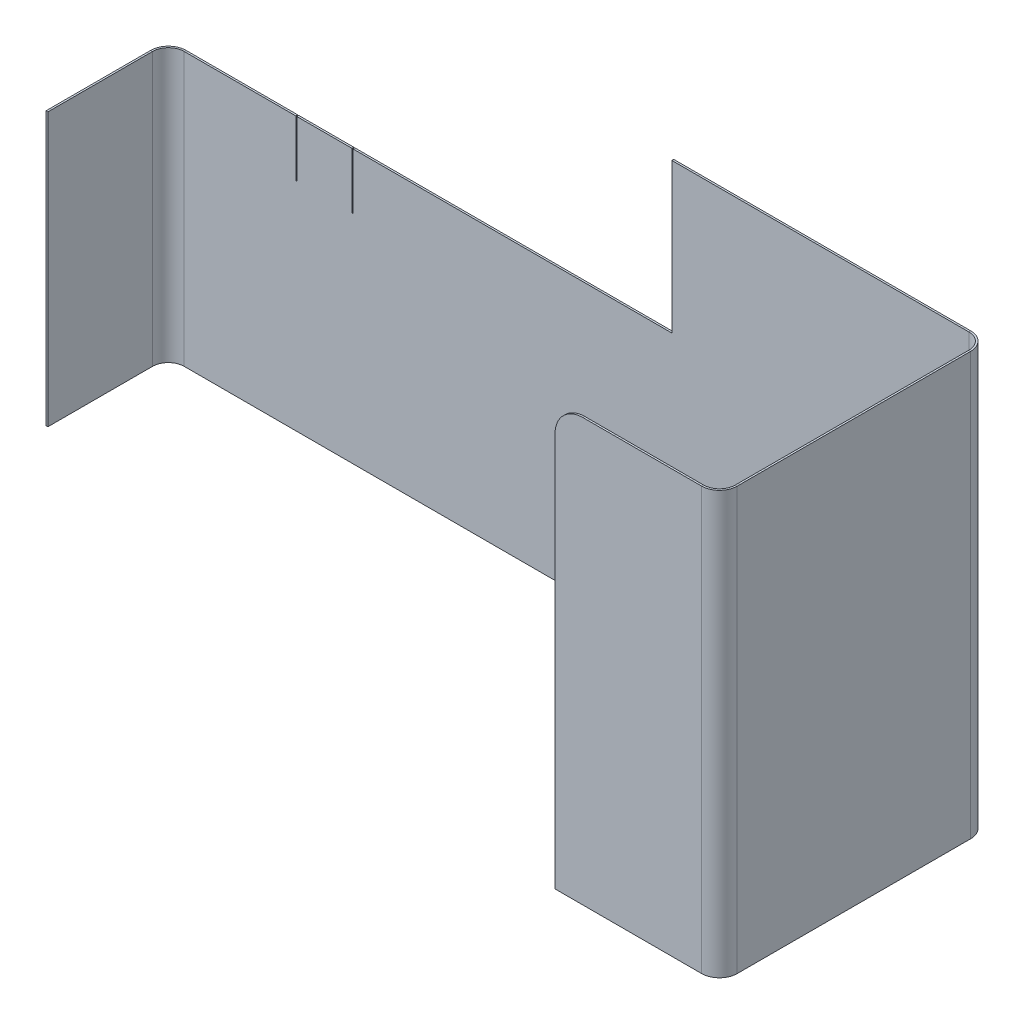
ISO-10303-21;
HEADER;
FILE_DESCRIPTION(('STEP AP214'),'2;1');
FILE_NAME('part.step','',(''),(''),'','','');
FILE_SCHEMA(('AUTOMOTIVE_DESIGN { 1 0 10303 214 1 1 1 1 }'));
ENDSEC;
DATA;
#1=APPLICATION_CONTEXT('core data for automotive mechanical design processes');
#2=APPLICATION_PROTOCOL_DEFINITION('international standard','automotive_design',2000,#1);
#3=PRODUCT_CONTEXT('',#1,'mechanical');
#4=PRODUCT('Part','Part','',(#3));
#5=PRODUCT_RELATED_PRODUCT_CATEGORY('part','',(#4));
#6=PRODUCT_DEFINITION_FORMATION('','',#4);
#7=PRODUCT_DEFINITION_CONTEXT('part definition',#1,'design');
#8=PRODUCT_DEFINITION('design','',#6,#7);
#9=PRODUCT_DEFINITION_SHAPE('','',#8);
#10=(LENGTH_UNIT() NAMED_UNIT(*) SI_UNIT(.MILLI.,.METRE.));
#11=(NAMED_UNIT(*) PLANE_ANGLE_UNIT() SI_UNIT($,.RADIAN.));
#12=(NAMED_UNIT(*) SI_UNIT($,.STERADIAN.) SOLID_ANGLE_UNIT());
#13=UNCERTAINTY_MEASURE_WITH_UNIT(LENGTH_MEASURE(1.E-05),#10,'distance_accuracy_value','');
#14=(GEOMETRIC_REPRESENTATION_CONTEXT(3) GLOBAL_UNCERTAINTY_ASSIGNED_CONTEXT((#13)) GLOBAL_UNIT_ASSIGNED_CONTEXT((#10,
#11,#12)) REPRESENTATION_CONTEXT('',''));
#15=CARTESIAN_POINT('',(0.,0.,0.));
#16=DIRECTION('',(0.,0.,1.));
#17=DIRECTION('',(1.,0.,0.));
#18=AXIS2_PLACEMENT_3D('',#15,#16,#17);
#19=CARTESIAN_POINT('',(0.,146.,0.));
#20=DIRECTION('',(0.,-1.,0.));
#21=DIRECTION('',(0.,0.,-1.));
#22=AXIS2_PLACEMENT_3D('',#19,#20,#21);
#23=PLANE('',#22);
#24=DIRECTION('',(-1.,0.,0.));
#25=VECTOR('',#24,1.);
#26=CARTESIAN_POINT('',(51.,146.,-94.5));
#27=LINE('',#26,#25);
#28=CARTESIAN_POINT('',(51.,146.,-94.5));
#29=VERTEX_POINT('',#28);
#30=CARTESIAN_POINT('',(-119.75,146.,-94.5));
#31=VERTEX_POINT('',#30);
#32=EDGE_CURVE('E276',#29,#31,#27,.T.);
#33=ORIENTED_EDGE('',*,*,#32,.T.);
#34=DIRECTION('',(0.,0.,-1.));
#35=VECTOR('',#34,1.);
#36=CARTESIAN_POINT('',(-119.75,146.,-84.5));
#37=LINE('',#36,#35);
#38=CARTESIAN_POINT('',(-119.75,146.,-93.5));
#39=VERTEX_POINT('',#38);
#40=EDGE_CURVE('E243',#39,#31,#37,.T.);
#41=ORIENTED_EDGE('',*,*,#40,.F.);
#42=DIRECTION('',(1.,0.,0.));
#43=VECTOR('',#42,1.);
#44=CARTESIAN_POINT('',(219.5,146.,-93.5));
#45=LINE('',#44,#43);
#46=CARTESIAN_POINT('',(51.,146.,-93.5));
#47=VERTEX_POINT('',#46);
#48=EDGE_CURVE('E287',#39,#47,#45,.T.);
#49=ORIENTED_EDGE('',*,*,#48,.T.);
#50=DIRECTION('',(0.,0.,-1.));
#51=VECTOR('',#50,1.);
#52=CARTESIAN_POINT('',(51.,146.,-94.5));
#53=LINE('',#52,#51);
#54=EDGE_CURVE('E273',#47,#29,#53,.T.);
#55=ORIENTED_EDGE('',*,*,#54,.T.);
#56=EDGE_LOOP('',(#33,#41,#49,#55));
#57=FACE_BOUND('',#56,.T.);
#58=ADVANCED_FACE('F38',(#57),#23,.F.);
#59=CARTESIAN_POINT('',(-210.,146.,-93.5));
#60=VERTEX_POINT('',#59);
#61=CARTESIAN_POINT('',(-150.25,146.,-93.5));
#62=VERTEX_POINT('',#61);
#63=EDGE_CURVE('E288',#60,#62,#45,.T.);
#64=ORIENTED_EDGE('',*,*,#63,.T.);
#65=DIRECTION('',(0.,0.,-1.));
#66=VECTOR('',#65,1.);
#67=CARTESIAN_POINT('',(-150.25,146.,-84.5));
#68=LINE('',#67,#66);
#69=CARTESIAN_POINT('',(-150.25,146.,-94.5));
#70=VERTEX_POINT('',#69);
#71=EDGE_CURVE('E254',#62,#70,#68,.T.);
#72=ORIENTED_EDGE('',*,*,#71,.T.);
#73=CARTESIAN_POINT('',(-210.,146.,-94.5));
#74=VERTEX_POINT('',#73);
#75=EDGE_CURVE('E275',#70,#74,#27,.T.);
#76=ORIENTED_EDGE('',*,*,#75,.T.);
#77=DIRECTION('',(0.,0.,1.));
#78=VECTOR('',#77,1.);
#79=CARTESIAN_POINT('',(-210.,146.,-94.5));
#80=LINE('',#79,#78);
#81=EDGE_CURVE('E11',#74,#60,#80,.T.);
#82=ORIENTED_EDGE('',*,*,#81,.T.);
#83=EDGE_LOOP('',(#64,#72,#76,#82));
#84=FACE_BOUND('',#83,.T.);
#85=ADVANCED_FACE('F494',(#84),#23,.F.);
#86=CARTESIAN_POINT('',(-149.75,146.,-93.5));
#87=VERTEX_POINT('',#86);
#88=CARTESIAN_POINT('',(-120.25,146.,-93.5));
#89=VERTEX_POINT('',#88);
#90=EDGE_CURVE('E292',#87,#89,#45,.T.);
#91=ORIENTED_EDGE('',*,*,#90,.T.);
#92=DIRECTION('',(0.,0.,-1.));
#93=VECTOR('',#92,1.);
#94=CARTESIAN_POINT('',(-120.25,146.,-84.5));
#95=LINE('',#94,#93);
#96=CARTESIAN_POINT('',(-120.25,146.,-94.5));
#97=VERTEX_POINT('',#96);
#98=EDGE_CURVE('E227',#89,#97,#95,.T.);
#99=ORIENTED_EDGE('',*,*,#98,.T.);
#100=CARTESIAN_POINT('',(-149.75,146.,-94.5));
#101=VERTEX_POINT('',#100);
#102=EDGE_CURVE('E238',#97,#101,#27,.T.);
#103=ORIENTED_EDGE('',*,*,#102,.T.);
#104=DIRECTION('',(0.,0.,-1.));
#105=VECTOR('',#104,1.);
#106=CARTESIAN_POINT('',(-149.75,146.,-84.5));
#107=LINE('',#106,#105);
#108=EDGE_CURVE('E61',#87,#101,#107,.T.);
#109=ORIENTED_EDGE('',*,*,#108,.F.);
#110=EDGE_LOOP('',(#91,#99,#103,#109));
#111=FACE_BOUND('',#110,.T.);
#112=ADVANCED_FACE('F499',(#111),#23,.F.);
#113=DIRECTION('',(0.,0.,-1.));
#114=VECTOR('',#113,1.);
#115=CARTESIAN_POINT('',(-218.5,146.,-94.5));
#116=LINE('',#115,#114);
#117=CARTESIAN_POINT('',(-218.5,146.,-29.));
#118=VERTEX_POINT('',#117);
#119=CARTESIAN_POINT('',(-218.5,146.,-85.));
#120=VERTEX_POINT('',#119);
#121=EDGE_CURVE('E295',#118,#120,#116,.T.);
#122=ORIENTED_EDGE('',*,*,#121,.T.);
#123=DIRECTION('',(-1.,0.,0.));
#124=VECTOR('',#123,1.);
#125=CARTESIAN_POINT('',(-218.5,146.,-85.));
#126=LINE('',#125,#124);
#127=CARTESIAN_POINT('',(-219.5,146.,-85.));
#128=VERTEX_POINT('',#127);
#129=EDGE_CURVE('E46',#120,#128,#126,.T.);
#130=ORIENTED_EDGE('',*,*,#129,.T.);
#131=DIRECTION('',(0.,0.,1.));
#132=VECTOR('',#131,1.);
#133=CARTESIAN_POINT('',(-219.5,146.,-94.5));
#134=LINE('',#133,#132);
#135=CARTESIAN_POINT('',(-219.5,146.,-29.));
#136=VERTEX_POINT('',#135);
#137=EDGE_CURVE('E279',#128,#136,#134,.T.);
#138=ORIENTED_EDGE('',*,*,#137,.T.);
#139=DIRECTION('',(1.,0.,0.));
#140=VECTOR('',#139,1.);
#141=CARTESIAN_POINT('',(51.,146.,-29.));
#142=LINE('',#141,#140);
#143=EDGE_CURVE('E281',#136,#118,#142,.T.);
#144=ORIENTED_EDGE('',*,*,#143,.T.);
#145=EDGE_LOOP('',(#122,#130,#138,#144));
#146=FACE_BOUND('',#145,.T.);
#147=ADVANCED_FACE('F452',(#146),#23,.F.);
#148=CARTESIAN_POINT('',(210.,226.,49.5));
#149=DIRECTION('',(0.,1.,0.));
#150=DIRECTION('',(0.,0.,1.));
#151=AXIS2_PLACEMENT_3D('',#148,#149,#150);
#152=PLANE('',#151);
#153=DIRECTION('',(0.,0.,-1.));
#154=VECTOR('',#153,1.);
#155=CARTESIAN_POINT('',(210.,226.,49.5));
#156=LINE('',#155,#154);
#157=CARTESIAN_POINT('',(210.,226.,49.5));
#158=VERTEX_POINT('',#157);
#159=CARTESIAN_POINT('',(210.,226.,48.5));
#160=VERTEX_POINT('',#159);
#161=EDGE_CURVE('E436',#158,#160,#156,.T.);
#162=ORIENTED_EDGE('',*,*,#161,.F.);
#163=CARTESIAN_POINT('',(210.,226.,40.));
#164=DIRECTION('',(0.,-1.,0.));
#165=DIRECTION('',(0.,0.,-1.));
#166=AXIS2_PLACEMENT_3D('',#163,#164,#165);
#167=CIRCLE('',#166,9.5);
#168=CARTESIAN_POINT('',(219.5,226.,40.));
#169=VERTEX_POINT('',#168);
#170=EDGE_CURVE('E318',#158,#169,#167,.F.);
#171=ORIENTED_EDGE('',*,*,#170,.T.);
#172=DIRECTION('',(1.,0.,0.));
#173=VECTOR('',#172,1.);
#174=CARTESIAN_POINT('',(218.5,226.,40.));
#175=LINE('',#174,#173);
#176=CARTESIAN_POINT('',(218.5,226.,40.));
#177=VERTEX_POINT('',#176);
#178=EDGE_CURVE('E434',#177,#169,#175,.T.);
#179=ORIENTED_EDGE('',*,*,#178,.F.);
#180=CARTESIAN_POINT('',(210.,226.,40.));
#181=DIRECTION('',(0.,1.,0.));
#182=DIRECTION('',(1.,0.,0.));
#183=AXIS2_PLACEMENT_3D('',#180,#181,#182);
#184=CIRCLE('',#183,8.5);
#185=EDGE_CURVE('E311',#160,#177,#184,.T.);
#186=ORIENTED_EDGE('',*,*,#185,.F.);
#187=EDGE_LOOP('',(#162,#171,#179,#186));
#188=FACE_BOUND('',#187,.T.);
#189=ADVANCED_FACE('F549',(#188),#152,.T.);
#190=CARTESIAN_POINT('',(218.5,226.,40.));
#191=DIRECTION('',(0.,1.,0.));
#192=DIRECTION('',(0.,0.,1.));
#193=AXIS2_PLACEMENT_3D('',#190,#191,#192);
#194=PLANE('',#193);
#195=DIRECTION('',(1.,0.,0.));
#196=VECTOR('',#195,1.);
#197=CARTESIAN_POINT('',(131.5,226.,48.5));
#198=LINE('',#197,#196);
#199=CARTESIAN_POINT('',(146.5,226.,48.5));
#200=VERTEX_POINT('',#199);
#201=EDGE_CURVE('E314',#200,#160,#198,.T.);
#202=ORIENTED_EDGE('',*,*,#201,.F.);
#203=DIRECTION('',(0.,0.,-1.));
#204=VECTOR('',#203,1.);
#205=CARTESIAN_POINT('',(146.5,226.,40.));
#206=LINE('',#205,#204);
#207=CARTESIAN_POINT('',(146.5,226.,49.5));
#208=VERTEX_POINT('',#207);
#209=EDGE_CURVE('E444',#200,#208,#206,.F.);
#210=ORIENTED_EDGE('',*,*,#209,.T.);
#211=DIRECTION('',(1.,0.,0.));
#212=VECTOR('',#211,1.);
#213=CARTESIAN_POINT('',(131.5,226.,49.5));
#214=LINE('',#213,#212);
#215=EDGE_CURVE('E316',#208,#158,#214,.T.);
#216=ORIENTED_EDGE('',*,*,#215,.T.);
#217=ORIENTED_EDGE('',*,*,#161,.T.);
#218=EDGE_LOOP('',(#202,#210,#216,#217));
#219=FACE_BOUND('',#218,.T.);
#220=ADVANCED_FACE('F554',(#219),#194,.T.);
#221=CARTESIAN_POINT('',(219.5,0.,40.));
#222=DIRECTION('',(0.,-1.,0.));
#223=DIRECTION('',(0.,0.,-1.));
#224=AXIS2_PLACEMENT_3D('',#221,#222,#223);
#225=PLANE('',#224);
#226=DIRECTION('',(-1.,0.,0.));
#227=VECTOR('',#226,1.);
#228=CARTESIAN_POINT('',(219.5,0.,40.));
#229=LINE('',#228,#227);
#230=CARTESIAN_POINT('',(219.5,0.,40.));
#231=VERTEX_POINT('',#230);
#232=CARTESIAN_POINT('',(218.5,0.,40.));
#233=VERTEX_POINT('',#232);
#234=EDGE_CURVE('E432',#231,#233,#229,.T.);
#235=ORIENTED_EDGE('',*,*,#234,.F.);
#236=CARTESIAN_POINT('',(210.,0.,40.));
#237=DIRECTION('',(0.,-1.,0.));
#238=DIRECTION('',(0.,0.,-1.));
#239=AXIS2_PLACEMENT_3D('',#236,#237,#238);
#240=CIRCLE('',#239,9.5);
#241=CARTESIAN_POINT('',(210.,0.,49.5));
#242=VERTEX_POINT('',#241);
#243=EDGE_CURVE('E363',#242,#231,#240,.F.);
#244=ORIENTED_EDGE('',*,*,#243,.F.);
#245=DIRECTION('',(0.,0.,1.));
#246=VECTOR('',#245,1.);
#247=CARTESIAN_POINT('',(210.,0.,48.5));
#248=LINE('',#247,#246);
#249=CARTESIAN_POINT('',(210.,0.,48.5));
#250=VERTEX_POINT('',#249);
#251=EDGE_CURVE('E430',#250,#242,#248,.T.);
#252=ORIENTED_EDGE('',*,*,#251,.F.);
#253=CARTESIAN_POINT('',(210.,0.,40.));
#254=DIRECTION('',(0.,1.,0.));
#255=DIRECTION('',(1.,0.,0.));
#256=AXIS2_PLACEMENT_3D('',#253,#254,#255);
#257=CIRCLE('',#256,8.5);
#258=EDGE_CURVE('E351',#250,#233,#257,.T.);
#259=ORIENTED_EDGE('',*,*,#258,.T.);
#260=EDGE_LOOP('',(#235,#244,#252,#259));
#261=FACE_BOUND('',#260,.T.);
#262=ADVANCED_FACE('F702',(#261),#225,.T.);
#263=CARTESIAN_POINT('',(210.,0.,48.5));
#264=DIRECTION('',(0.,-1.,0.));
#265=DIRECTION('',(0.,0.,-1.));
#266=AXIS2_PLACEMENT_3D('',#263,#264,#265);
#267=PLANE('',#266);
#268=DIRECTION('',(0.,0.,-1.));
#269=VECTOR('',#268,1.);
#270=CARTESIAN_POINT('',(219.5,0.,49.5));
#271=LINE('',#270,#269);
#272=CARTESIAN_POINT('',(219.5,0.,-85.));
#273=VERTEX_POINT('',#272);
#274=EDGE_CURVE('E366',#231,#273,#271,.T.);
#275=ORIENTED_EDGE('',*,*,#274,.F.);
#276=ORIENTED_EDGE('',*,*,#234,.T.);
#277=DIRECTION('',(0.,0.,-1.));
#278=VECTOR('',#277,1.);
#279=CARTESIAN_POINT('',(218.5,0.,49.5));
#280=LINE('',#279,#278);
#281=CARTESIAN_POINT('',(218.5,0.,-85.));
#282=VERTEX_POINT('',#281);
#283=EDGE_CURVE('E348',#233,#282,#280,.T.);
#284=ORIENTED_EDGE('',*,*,#283,.T.);
#285=DIRECTION('',(1.,0.,0.));
#286=VECTOR('',#285,1.);
#287=CARTESIAN_POINT('',(218.5,0.,-85.));
#288=LINE('',#287,#286);
#289=EDGE_CURVE('E422',#282,#273,#288,.T.);
#290=ORIENTED_EDGE('',*,*,#289,.T.);
#291=EDGE_LOOP('',(#275,#276,#284,#290));
#292=FACE_BOUND('',#291,.T.);
#293=ADVANCED_FACE('F823',(#292),#267,.T.);
#294=CARTESIAN_POINT('',(219.5,226.,-85.));
#295=DIRECTION('',(0.,1.,0.));
#296=DIRECTION('',(0.,0.,1.));
#297=AXIS2_PLACEMENT_3D('',#294,#295,#296);
#298=PLANE('',#297);
#299=DIRECTION('',(-1.,0.,0.));
#300=VECTOR('',#299,1.);
#301=CARTESIAN_POINT('',(219.5,226.,-85.));
#302=LINE('',#301,#300);
#303=CARTESIAN_POINT('',(219.5,226.,-85.));
#304=VERTEX_POINT('',#303);
#305=CARTESIAN_POINT('',(218.5,226.,-85.));
#306=VERTEX_POINT('',#305);
#307=EDGE_CURVE('E428',#304,#306,#302,.T.);
#308=ORIENTED_EDGE('',*,*,#307,.F.);
#309=CARTESIAN_POINT('',(210.,226.,-85.));
#310=DIRECTION('',(0.,-1.,0.));
#311=DIRECTION('',(0.,0.,-1.));
#312=AXIS2_PLACEMENT_3D('',#309,#310,#311);
#313=CIRCLE('',#312,9.5);
#314=CARTESIAN_POINT('',(210.,226.,-94.5));
#315=VERTEX_POINT('',#314);
#316=EDGE_CURVE('E324',#304,#315,#313,.F.);
#317=ORIENTED_EDGE('',*,*,#316,.T.);
#318=DIRECTION('',(0.,0.,-1.));
#319=VECTOR('',#318,1.);
#320=CARTESIAN_POINT('',(210.,226.,-93.5));
#321=LINE('',#320,#319);
#322=CARTESIAN_POINT('',(210.,226.,-93.5));
#323=VERTEX_POINT('',#322);
#324=EDGE_CURVE('E426',#323,#315,#321,.T.);
#325=ORIENTED_EDGE('',*,*,#324,.F.);
#326=CARTESIAN_POINT('',(210.,226.,-85.));
#327=DIRECTION('',(0.,1.,0.));
#328=DIRECTION('',(1.,0.,0.));
#329=AXIS2_PLACEMENT_3D('',#326,#327,#328);
#330=CIRCLE('',#329,8.5);
#331=EDGE_CURVE('E304',#306,#323,#330,.T.);
#332=ORIENTED_EDGE('',*,*,#331,.F.);
#333=EDGE_LOOP('',(#308,#317,#325,#332));
#334=FACE_BOUND('',#333,.T.);
#335=ADVANCED_FACE('F812',(#334),#298,.T.);
#336=CARTESIAN_POINT('',(210.,226.,-93.5));
#337=DIRECTION('',(0.,1.,0.));
#338=DIRECTION('',(0.,0.,1.));
#339=AXIS2_PLACEMENT_3D('',#336,#337,#338);
#340=PLANE('',#339);
#341=DIRECTION('',(0.,0.,-1.));
#342=VECTOR('',#341,1.);
#343=CARTESIAN_POINT('',(219.5,226.,49.5));
#344=LINE('',#343,#342);
#345=EDGE_CURVE('E321',#169,#304,#344,.T.);
#346=ORIENTED_EDGE('',*,*,#345,.T.);
#347=ORIENTED_EDGE('',*,*,#307,.T.);
#348=DIRECTION('',(0.,0.,-1.));
#349=VECTOR('',#348,1.);
#350=CARTESIAN_POINT('',(218.5,226.,49.5));
#351=LINE('',#350,#349);
#352=EDGE_CURVE('E308',#177,#306,#351,.T.);
#353=ORIENTED_EDGE('',*,*,#352,.F.);
#354=ORIENTED_EDGE('',*,*,#178,.T.);
#355=EDGE_LOOP('',(#346,#347,#353,#354));
#356=FACE_BOUND('',#355,.T.);
#357=ADVANCED_FACE('F801',(#356),#340,.T.);
#358=CARTESIAN_POINT('',(210.,0.,-94.5));
#359=DIRECTION('',(0.,-1.,0.));
#360=DIRECTION('',(0.,0.,-1.));
#361=AXIS2_PLACEMENT_3D('',#358,#359,#360);
#362=PLANE('',#361);
#363=DIRECTION('',(0.,0.,1.));
#364=VECTOR('',#363,1.);
#365=CARTESIAN_POINT('',(210.,0.,-94.5));
#366=LINE('',#365,#364);
#367=CARTESIAN_POINT('',(210.,0.,-94.5));
#368=VERTEX_POINT('',#367);
#369=CARTESIAN_POINT('',(210.,0.,-93.5));
#370=VERTEX_POINT('',#369);
#371=EDGE_CURVE('E424',#368,#370,#366,.T.);
#372=ORIENTED_EDGE('',*,*,#371,.F.);
#373=CARTESIAN_POINT('',(210.,0.,-85.));
#374=DIRECTION('',(0.,-1.,0.));
#375=DIRECTION('',(0.,0.,-1.));
#376=AXIS2_PLACEMENT_3D('',#373,#374,#375);
#377=CIRCLE('',#376,9.5);
#378=EDGE_CURVE('E369',#273,#368,#377,.F.);
#379=ORIENTED_EDGE('',*,*,#378,.F.);
#380=ORIENTED_EDGE('',*,*,#289,.F.);
#381=CARTESIAN_POINT('',(210.,0.,-85.));
#382=DIRECTION('',(0.,1.,0.));
#383=DIRECTION('',(1.,0.,0.));
#384=AXIS2_PLACEMENT_3D('',#381,#382,#383);
#385=CIRCLE('',#384,8.5);
#386=EDGE_CURVE('E345',#282,#370,#385,.T.);
#387=ORIENTED_EDGE('',*,*,#386,.T.);
#388=EDGE_LOOP('',(#372,#379,#380,#387));
#389=FACE_BOUND('',#388,.T.);
#390=ADVANCED_FACE('F791',(#389),#362,.T.);
#391=CARTESIAN_POINT('',(218.5,0.,-85.));
#392=DIRECTION('',(0.,-1.,0.));
#393=DIRECTION('',(0.,0.,-1.));
#394=AXIS2_PLACEMENT_3D('',#391,#392,#393);
#395=PLANE('',#394);
#396=DIRECTION('',(-1.,0.,0.));
#397=VECTOR('',#396,1.);
#398=CARTESIAN_POINT('',(219.5,0.,-94.5));
#399=LINE('',#398,#397);
#400=CARTESIAN_POINT('',(-210.,0.,-94.5));
#401=VERTEX_POINT('',#400);
#402=EDGE_CURVE('E372',#368,#401,#399,.T.);
#403=ORIENTED_EDGE('',*,*,#402,.F.);
#404=ORIENTED_EDGE('',*,*,#371,.T.);
#405=DIRECTION('',(-1.,0.,0.));
#406=VECTOR('',#405,1.);
#407=CARTESIAN_POINT('',(219.5,0.,-93.5));
#408=LINE('',#407,#406);
#409=CARTESIAN_POINT('',(-210.,0.,-93.5));
#410=VERTEX_POINT('',#409);
#411=EDGE_CURVE('E342',#370,#410,#408,.T.);
#412=ORIENTED_EDGE('',*,*,#411,.T.);
#413=DIRECTION('',(0.,0.,-1.));
#414=VECTOR('',#413,1.);
#415=CARTESIAN_POINT('',(-210.,0.,-93.5));
#416=LINE('',#415,#414);
#417=EDGE_CURVE('E416',#410,#401,#416,.T.);
#418=ORIENTED_EDGE('',*,*,#417,.T.);
#419=EDGE_LOOP('',(#403,#404,#412,#418));
#420=FACE_BOUND('',#419,.T.);
#421=ADVANCED_FACE('F523',(#420),#395,.T.);
#422=CARTESIAN_POINT('',(-218.5,226.,-85.));
#423=DIRECTION('',(0.,1.,0.));
#424=DIRECTION('',(0.,0.,1.));
#425=AXIS2_PLACEMENT_3D('',#422,#423,#424);
#426=PLANE('',#425);
#427=DIRECTION('',(0.,0.,-1.));
#428=VECTOR('',#427,1.);
#429=CARTESIAN_POINT('',(51.,226.,-94.5));
#430=LINE('',#429,#428);
#431=CARTESIAN_POINT('',(51.,226.,-93.5));
#432=VERTEX_POINT('',#431);
#433=CARTESIAN_POINT('',(51.,226.,-94.5));
#434=VERTEX_POINT('',#433);
#435=EDGE_CURVE('E272',#432,#434,#430,.T.);
#436=ORIENTED_EDGE('',*,*,#435,.F.);
#437=DIRECTION('',(-1.,0.,0.));
#438=VECTOR('',#437,1.);
#439=CARTESIAN_POINT('',(219.5,226.,-93.5));
#440=LINE('',#439,#438);
#441=EDGE_CURVE('E301',#323,#432,#440,.T.);
#442=ORIENTED_EDGE('',*,*,#441,.F.);
#443=ORIENTED_EDGE('',*,*,#324,.T.);
#444=DIRECTION('',(-1.,0.,0.));
#445=VECTOR('',#444,1.);
#446=CARTESIAN_POINT('',(219.5,226.,-94.5));
#447=LINE('',#446,#445);
#448=EDGE_CURVE('E327',#315,#434,#447,.T.);
#449=ORIENTED_EDGE('',*,*,#448,.T.);
#450=EDGE_LOOP('',(#436,#442,#443,#449));
#451=FACE_BOUND('',#450,.T.);
#452=ADVANCED_FACE('F516',(#451),#426,.T.);
#453=CARTESIAN_POINT('',(-219.5,0.,-85.));
#454=DIRECTION('',(0.,-1.,0.));
#455=DIRECTION('',(0.,0.,-1.));
#456=AXIS2_PLACEMENT_3D('',#453,#454,#455);
#457=PLANE('',#456);
#458=DIRECTION('',(1.,0.,0.));
#459=VECTOR('',#458,1.);
#460=CARTESIAN_POINT('',(-219.5,0.,-85.));
#461=LINE('',#460,#459);
#462=CARTESIAN_POINT('',(-219.5,0.,-85.));
#463=VERTEX_POINT('',#462);
#464=CARTESIAN_POINT('',(-218.5,0.,-85.));
#465=VERTEX_POINT('',#464);
#466=EDGE_CURVE('E419',#463,#465,#461,.T.);
#467=ORIENTED_EDGE('',*,*,#466,.F.);
#468=CARTESIAN_POINT('',(-210.,0.,-85.));
#469=DIRECTION('',(0.,-1.,0.));
#470=DIRECTION('',(0.,0.,-1.));
#471=AXIS2_PLACEMENT_3D('',#468,#469,#470);
#472=CIRCLE('',#471,9.5);
#473=EDGE_CURVE('E305',#401,#463,#472,.F.);
#474=ORIENTED_EDGE('',*,*,#473,.F.);
#475=ORIENTED_EDGE('',*,*,#417,.F.);
#476=CARTESIAN_POINT('',(-210.,0.,-85.));
#477=DIRECTION('',(0.,1.,0.));
#478=DIRECTION('',(1.,0.,0.));
#479=AXIS2_PLACEMENT_3D('',#476,#477,#478);
#480=CIRCLE('',#479,8.5);
#481=EDGE_CURVE('E339',#410,#465,#480,.T.);
#482=ORIENTED_EDGE('',*,*,#481,.T.);
#483=EDGE_LOOP('',(#467,#474,#475,#482));
#484=FACE_BOUND('',#483,.T.);
#485=ADVANCED_FACE('F524',(#484),#457,.T.);
#486=CARTESIAN_POINT('',(-210.,0.,-93.5));
#487=DIRECTION('',(0.,-1.,0.));
#488=DIRECTION('',(0.,0.,-1.));
#489=AXIS2_PLACEMENT_3D('',#486,#487,#488);
#490=PLANE('',#489);
#491=DIRECTION('',(0.,0.,1.));
#492=VECTOR('',#491,1.);
#493=CARTESIAN_POINT('',(-219.5,0.,-94.5));
#494=LINE('',#493,#492);
#495=CARTESIAN_POINT('',(-219.5,0.,-29.));
#496=VERTEX_POINT('',#495);
#497=EDGE_CURVE('E300',#463,#496,#494,.T.);
#498=ORIENTED_EDGE('',*,*,#497,.F.);
#499=ORIENTED_EDGE('',*,*,#466,.T.);
#500=DIRECTION('',(0.,0.,-1.));
#501=VECTOR('',#500,1.);
#502=CARTESIAN_POINT('',(-218.5,0.,-94.5));
#503=LINE('',#502,#501);
#504=CARTESIAN_POINT('',(-218.5,0.,-29.));
#505=VERTEX_POINT('',#504);
#506=EDGE_CURVE('E336',#465,#505,#503,.F.);
#507=ORIENTED_EDGE('',*,*,#506,.T.);
#508=DIRECTION('',(-1.,0.,0.));
#509=VECTOR('',#508,1.);
#510=CARTESIAN_POINT('',(-218.5,0.,-29.));
#511=LINE('',#510,#509);
#512=EDGE_CURVE('E333',#505,#496,#511,.T.);
#513=ORIENTED_EDGE('',*,*,#512,.T.);
#514=EDGE_LOOP('',(#498,#499,#507,#513));
#515=FACE_BOUND('',#514,.T.);
#516=ADVANCED_FACE('F473',(#515),#490,.T.);
#517=CARTESIAN_POINT('',(-219.5,226.,-94.5));
#518=DIRECTION('',(1.,0.,0.));
#519=DIRECTION('',(0.,0.,-1.));
#520=AXIS2_PLACEMENT_3D('',#517,#518,#519);
#521=PLANE('',#520);
#522=DIRECTION('',(0.,-1.,0.));
#523=VECTOR('',#522,1.);
#524=CARTESIAN_POINT('',(-219.5,226.,-29.));
#525=LINE('',#524,#523);
#526=EDGE_CURVE('E414',#136,#496,#525,.T.);
#527=ORIENTED_EDGE('',*,*,#526,.F.);
#528=ORIENTED_EDGE('',*,*,#137,.F.);
#529=DIRECTION('',(0.,-1.,0.));
#530=VECTOR('',#529,1.);
#531=CARTESIAN_POINT('',(-219.5,226.,-85.));
#532=LINE('',#531,#530);
#533=EDGE_CURVE('E330',#128,#463,#532,.T.);
#534=ORIENTED_EDGE('',*,*,#533,.T.);
#535=ORIENTED_EDGE('',*,*,#497,.T.);
#536=EDGE_LOOP('',(#527,#528,#534,#535));
#537=FACE_BOUND('',#536,.T.);
#538=ADVANCED_FACE('F465',(#537),#521,.F.);
#539=CARTESIAN_POINT('',(-218.5,226.,-29.));
#540=DIRECTION('',(0.,0.,1.));
#541=DIRECTION('',(1.,0.,0.));
#542=AXIS2_PLACEMENT_3D('',#539,#540,#541);
#543=PLANE('',#542);
#544=ORIENTED_EDGE('',*,*,#143,.F.);
#545=ORIENTED_EDGE('',*,*,#526,.T.);
#546=ORIENTED_EDGE('',*,*,#512,.F.);
#547=DIRECTION('',(0.,-1.,0.));
#548=VECTOR('',#547,1.);
#549=CARTESIAN_POINT('',(-218.5,226.,-29.));
#550=LINE('',#549,#548);
#551=EDGE_CURVE('E412',#118,#505,#550,.T.);
#552=ORIENTED_EDGE('',*,*,#551,.F.);
#553=EDGE_LOOP('',(#544,#545,#546,#552));
#554=FACE_BOUND('',#553,.T.);
#555=ADVANCED_FACE('F478',(#554),#543,.T.);
#556=CARTESIAN_POINT('',(-218.5,226.,-94.5));
#557=DIRECTION('',(1.,0.,0.));
#558=DIRECTION('',(0.,0.,-1.));
#559=AXIS2_PLACEMENT_3D('',#556,#557,#558);
#560=PLANE('',#559);
#561=ORIENTED_EDGE('',*,*,#121,.F.);
#562=ORIENTED_EDGE('',*,*,#551,.T.);
#563=ORIENTED_EDGE('',*,*,#506,.F.);
#564=DIRECTION('',(0.,-1.,0.));
#565=VECTOR('',#564,1.);
#566=CARTESIAN_POINT('',(-218.5,226.,-85.));
#567=LINE('',#566,#565);
#568=EDGE_CURVE('E410',#120,#465,#567,.T.);
#569=ORIENTED_EDGE('',*,*,#568,.F.);
#570=EDGE_LOOP('',(#561,#562,#563,#569));
#571=FACE_BOUND('',#570,.T.);
#572=ADVANCED_FACE('F481',(#571),#560,.T.);
#573=CARTESIAN_POINT('',(-210.,226.,-85.));
#574=DIRECTION('',(0.,-1.,0.));
#575=DIRECTION('',(0.,0.,-1.));
#576=AXIS2_PLACEMENT_3D('',#573,#574,#575);
#577=CYLINDRICAL_SURFACE('',#576,8.5);
#578=CARTESIAN_POINT('',(-210.,146.,-85.));
#579=DIRECTION('',(0.,-1.,0.));
#580=DIRECTION('',(0.,0.,-1.));
#581=AXIS2_PLACEMENT_3D('',#578,#579,#580);
#582=CIRCLE('',#581,8.5);
#583=EDGE_CURVE('E291',#120,#60,#582,.T.);
#584=ORIENTED_EDGE('',*,*,#583,.F.);
#585=ORIENTED_EDGE('',*,*,#568,.T.);
#586=ORIENTED_EDGE('',*,*,#481,.F.);
#587=DIRECTION('',(0.,-1.,0.));
#588=VECTOR('',#587,1.);
#589=CARTESIAN_POINT('',(-210.,226.,-93.5));
#590=LINE('',#589,#588);
#591=EDGE_CURVE('E408',#60,#410,#590,.T.);
#592=ORIENTED_EDGE('',*,*,#591,.F.);
#593=EDGE_LOOP('',(#584,#585,#586,#592));
#594=FACE_BOUND('',#593,.T.);
#595=ADVANCED_FACE('F484',(#594),#577,.F.);
#596=CARTESIAN_POINT('',(219.5,226.,-93.5));
#597=DIRECTION('',(0.,0.,1.));
#598=DIRECTION('',(1.,0.,0.));
#599=AXIS2_PLACEMENT_3D('',#596,#597,#598);
#600=PLANE('',#599);
#601=DIRECTION('',(0.,1.,0.));
#602=VECTOR('',#601,1.);
#603=CARTESIAN_POINT('',(-119.75,226.,-93.5));
#604=LINE('',#603,#602);
#605=CARTESIAN_POINT('',(-119.75,116.,-93.5));
#606=VERTEX_POINT('',#605);
#607=EDGE_CURVE('E270',#606,#39,#604,.T.);
#608=ORIENTED_EDGE('',*,*,#607,.F.);
#609=DIRECTION('',(1.,0.,0.));
#610=VECTOR('',#609,1.);
#611=CARTESIAN_POINT('',(219.5,116.,-93.5));
#612=LINE('',#611,#610);
#613=CARTESIAN_POINT('',(-120.25,116.,-93.5));
#614=VERTEX_POINT('',#613);
#615=EDGE_CURVE('E267',#614,#606,#612,.T.);
#616=ORIENTED_EDGE('',*,*,#615,.F.);
#617=DIRECTION('',(0.,-1.,0.));
#618=VECTOR('',#617,1.);
#619=CARTESIAN_POINT('',(-120.25,226.,-93.5));
#620=LINE('',#619,#618);
#621=EDGE_CURVE('E224',#89,#614,#620,.T.);
#622=ORIENTED_EDGE('',*,*,#621,.F.);
#623=ORIENTED_EDGE('',*,*,#90,.F.);
#624=DIRECTION('',(0.,1.,0.));
#625=VECTOR('',#624,1.);
#626=CARTESIAN_POINT('',(-149.75,226.000000000001,-93.5));
#627=LINE('',#626,#625);
#628=CARTESIAN_POINT('',(-149.75,116.,-93.5));
#629=VERTEX_POINT('',#628);
#630=EDGE_CURVE('E245',#629,#87,#627,.T.);
#631=ORIENTED_EDGE('',*,*,#630,.F.);
#632=DIRECTION('',(1.,0.,0.));
#633=VECTOR('',#632,1.);
#634=CARTESIAN_POINT('',(219.5,116.,-93.5));
#635=LINE('',#634,#633);
#636=CARTESIAN_POINT('',(-150.25,116.,-93.5));
#637=VERTEX_POINT('',#636);
#638=EDGE_CURVE('E263',#637,#629,#635,.T.);
#639=ORIENTED_EDGE('',*,*,#638,.F.);
#640=DIRECTION('',(0.,-1.,0.));
#641=VECTOR('',#640,1.);
#642=CARTESIAN_POINT('',(-150.25,226.,-93.5));
#643=LINE('',#642,#641);
#644=EDGE_CURVE('E265',#62,#637,#643,.T.);
#645=ORIENTED_EDGE('',*,*,#644,.F.);
#646=ORIENTED_EDGE('',*,*,#63,.F.);
#647=ORIENTED_EDGE('',*,*,#591,.T.);
#648=ORIENTED_EDGE('',*,*,#411,.F.);
#649=DIRECTION('',(0.,-1.,0.));
#650=VECTOR('',#649,1.);
#651=CARTESIAN_POINT('',(210.,226.,-93.5));
#652=LINE('',#651,#650);
#653=EDGE_CURVE('E405',#323,#370,#652,.T.);
#654=ORIENTED_EDGE('',*,*,#653,.F.);
#655=ORIENTED_EDGE('',*,*,#441,.T.);
#656=DIRECTION('',(0.,1.,0.));
#657=VECTOR('',#656,1.);
#658=CARTESIAN_POINT('',(51.,226.,-93.5));
#659=LINE('',#658,#657);
#660=EDGE_CURVE('E298',#47,#432,#659,.T.);
#661=ORIENTED_EDGE('',*,*,#660,.F.);
#662=ORIENTED_EDGE('',*,*,#48,.F.);
#663=EDGE_LOOP('',(#608,#616,#622,#623,#631,#639,#645,#646,#647,#648,#654,#655,#661,#662));
#664=FACE_BOUND('',#663,.T.);
#665=ADVANCED_FACE('F490',(#664),#600,.T.);
#666=CARTESIAN_POINT('',(210.,226.,-85.));
#667=DIRECTION('',(0.,-1.,0.));
#668=DIRECTION('',(0.,0.,-1.));
#669=AXIS2_PLACEMENT_3D('',#666,#667,#668);
#670=CYLINDRICAL_SURFACE('',#669,8.5);
#671=ORIENTED_EDGE('',*,*,#386,.F.);
#672=DIRECTION('',(0.,-1.,0.));
#673=VECTOR('',#672,1.);
#674=CARTESIAN_POINT('',(218.5,226.,-85.));
#675=LINE('',#674,#673);
#676=EDGE_CURVE('E402',#306,#282,#675,.T.);
#677=ORIENTED_EDGE('',*,*,#676,.F.);
#678=ORIENTED_EDGE('',*,*,#331,.T.);
#679=ORIENTED_EDGE('',*,*,#653,.T.);
#680=EDGE_LOOP('',(#671,#677,#678,#679));
#681=FACE_BOUND('',#680,.T.);
#682=ADVANCED_FACE('F762',(#681),#670,.F.);
#683=CARTESIAN_POINT('',(218.5,226.,49.5));
#684=DIRECTION('',(-1.,0.,0.));
#685=DIRECTION('',(0.,0.,1.));
#686=AXIS2_PLACEMENT_3D('',#683,#684,#685);
#687=PLANE('',#686);
#688=ORIENTED_EDGE('',*,*,#283,.F.);
#689=DIRECTION('',(0.,-1.,0.));
#690=VECTOR('',#689,1.);
#691=CARTESIAN_POINT('',(218.5,226.,40.));
#692=LINE('',#691,#690);
#693=EDGE_CURVE('E399',#177,#233,#692,.T.);
#694=ORIENTED_EDGE('',*,*,#693,.F.);
#695=ORIENTED_EDGE('',*,*,#352,.T.);
#696=ORIENTED_EDGE('',*,*,#676,.T.);
#697=EDGE_LOOP('',(#688,#694,#695,#696));
#698=FACE_BOUND('',#697,.T.);
#699=ADVANCED_FACE('F751',(#698),#687,.T.);
#700=CARTESIAN_POINT('',(210.,226.,40.));
#701=DIRECTION('',(0.,-1.,0.));
#702=DIRECTION('',(0.,0.,-1.));
#703=AXIS2_PLACEMENT_3D('',#700,#701,#702);
#704=CYLINDRICAL_SURFACE('',#703,8.5);
#705=ORIENTED_EDGE('',*,*,#258,.F.);
#706=DIRECTION('',(0.,-1.,0.));
#707=VECTOR('',#706,1.);
#708=CARTESIAN_POINT('',(210.,226.,48.5));
#709=LINE('',#708,#707);
#710=EDGE_CURVE('E396',#160,#250,#709,.T.);
#711=ORIENTED_EDGE('',*,*,#710,.F.);
#712=ORIENTED_EDGE('',*,*,#185,.T.);
#713=ORIENTED_EDGE('',*,*,#693,.T.);
#714=EDGE_LOOP('',(#705,#711,#712,#713));
#715=FACE_BOUND('',#714,.T.);
#716=ADVANCED_FACE('F689',(#715),#704,.F.);
#717=CARTESIAN_POINT('',(131.5,226.,48.5));
#718=DIRECTION('',(0.,0.,-1.));
#719=DIRECTION('',(-1.,0.,0.));
#720=AXIS2_PLACEMENT_3D('',#717,#718,#719);
#721=PLANE('',#720);
#722=DIRECTION('',(0.,-1.,0.));
#723=VECTOR('',#722,1.);
#724=CARTESIAN_POINT('',(131.5,226.,48.5));
#725=LINE('',#724,#723);
#726=CARTESIAN_POINT('',(131.5,211.,48.5));
#727=VERTEX_POINT('',#726);
#728=CARTESIAN_POINT('',(131.5,0.,48.5));
#729=VERTEX_POINT('',#728);
#730=EDGE_CURVE('E394',#727,#729,#725,.T.);
#731=ORIENTED_EDGE('',*,*,#730,.F.);
#732=CARTESIAN_POINT('',(146.5,211.,48.5));
#733=DIRECTION('',(0.,0.,-1.));
#734=DIRECTION('',(-1.,0.,0.));
#735=AXIS2_PLACEMENT_3D('',#732,#733,#734);
#736=CIRCLE('',#735,15.);
#737=EDGE_CURVE('E442',#727,#200,#736,.T.);
#738=ORIENTED_EDGE('',*,*,#737,.T.);
#739=ORIENTED_EDGE('',*,*,#201,.T.);
#740=ORIENTED_EDGE('',*,*,#710,.T.);
#741=DIRECTION('',(1.,0.,0.));
#742=VECTOR('',#741,1.);
#743=CARTESIAN_POINT('',(131.5,0.,48.5));
#744=LINE('',#743,#742);
#745=EDGE_CURVE('E354',#729,#250,#744,.T.);
#746=ORIENTED_EDGE('',*,*,#745,.F.);
#747=EDGE_LOOP('',(#731,#738,#739,#740,#746));
#748=FACE_BOUND('',#747,.T.);
#749=ADVANCED_FACE('F678',(#748),#721,.T.);
#750=CARTESIAN_POINT('',(131.5,226.,49.5));
#751=DIRECTION('',(-1.,0.,0.));
#752=DIRECTION('',(0.,0.,1.));
#753=AXIS2_PLACEMENT_3D('',#750,#751,#752);
#754=PLANE('',#753);
#755=DIRECTION('',(0.,-1.,0.));
#756=VECTOR('',#755,1.);
#757=CARTESIAN_POINT('',(131.5,226.,49.5));
#758=LINE('',#757,#756);
#759=CARTESIAN_POINT('',(131.5,211.,49.5));
#760=VERTEX_POINT('',#759);
#761=CARTESIAN_POINT('',(131.5,0.,49.5));
#762=VERTEX_POINT('',#761);
#763=EDGE_CURVE('E392',#760,#762,#758,.T.);
#764=ORIENTED_EDGE('',*,*,#763,.F.);
#765=DIRECTION('',(0.,0.,-1.));
#766=VECTOR('',#765,1.);
#767=CARTESIAN_POINT('',(131.5,211.,49.5));
#768=LINE('',#767,#766);
#769=EDGE_CURVE('E439',#760,#727,#768,.T.);
#770=ORIENTED_EDGE('',*,*,#769,.T.);
#771=ORIENTED_EDGE('',*,*,#730,.T.);
#772=DIRECTION('',(0.,0.,-1.));
#773=VECTOR('',#772,1.);
#774=CARTESIAN_POINT('',(131.5,0.,49.5));
#775=LINE('',#774,#773);
#776=EDGE_CURVE('E357',#762,#729,#775,.T.);
#777=ORIENTED_EDGE('',*,*,#776,.F.);
#778=EDGE_LOOP('',(#764,#770,#771,#777));
#779=FACE_BOUND('',#778,.T.);
#780=ADVANCED_FACE('F665',(#779),#754,.T.);
#781=CARTESIAN_POINT('',(131.5,226.,49.5));
#782=DIRECTION('',(0.,0.,-1.));
#783=DIRECTION('',(-1.,0.,0.));
#784=AXIS2_PLACEMENT_3D('',#781,#782,#783);
#785=PLANE('',#784);
#786=ORIENTED_EDGE('',*,*,#215,.F.);
#787=CARTESIAN_POINT('',(146.5,211.,49.5));
#788=DIRECTION('',(0.,0.,-1.));
#789=DIRECTION('',(-1.,0.,0.));
#790=AXIS2_PLACEMENT_3D('',#787,#788,#789);
#791=CIRCLE('',#790,15.);
#792=EDGE_CURVE('E446',#208,#760,#791,.F.);
#793=ORIENTED_EDGE('',*,*,#792,.T.);
#794=ORIENTED_EDGE('',*,*,#763,.T.);
#795=DIRECTION('',(1.,0.,0.));
#796=VECTOR('',#795,1.);
#797=CARTESIAN_POINT('',(131.5,0.,49.5));
#798=LINE('',#797,#796);
#799=EDGE_CURVE('E360',#762,#242,#798,.T.);
#800=ORIENTED_EDGE('',*,*,#799,.T.);
#801=DIRECTION('',(0.,-1.,0.));
#802=VECTOR('',#801,1.);
#803=CARTESIAN_POINT('',(210.,226.,49.5));
#804=LINE('',#803,#802);
#805=EDGE_CURVE('E389',#158,#242,#804,.T.);
#806=ORIENTED_EDGE('',*,*,#805,.F.);
#807=EDGE_LOOP('',(#786,#793,#794,#800,#806));
#808=FACE_BOUND('',#807,.T.);
#809=ADVANCED_FACE('F659',(#808),#785,.F.);
#810=CARTESIAN_POINT('',(210.,226.,40.));
#811=DIRECTION('',(0.,-1.,0.));
#812=DIRECTION('',(0.,0.,-1.));
#813=AXIS2_PLACEMENT_3D('',#810,#811,#812);
#814=CYLINDRICAL_SURFACE('',#813,9.5);
#815=ORIENTED_EDGE('',*,*,#243,.T.);
#816=DIRECTION('',(0.,-1.,0.));
#817=VECTOR('',#816,1.);
#818=CARTESIAN_POINT('',(219.5,226.,40.));
#819=LINE('',#818,#817);
#820=EDGE_CURVE('E386',#169,#231,#819,.T.);
#821=ORIENTED_EDGE('',*,*,#820,.F.);
#822=ORIENTED_EDGE('',*,*,#170,.F.);
#823=ORIENTED_EDGE('',*,*,#805,.T.);
#824=EDGE_LOOP('',(#815,#821,#822,#823));
#825=FACE_BOUND('',#824,.T.);
#826=ADVANCED_FACE('F664',(#825),#814,.T.);
#827=CARTESIAN_POINT('',(219.5,226.,49.5));
#828=DIRECTION('',(-1.,0.,0.));
#829=DIRECTION('',(0.,0.,1.));
#830=AXIS2_PLACEMENT_3D('',#827,#828,#829);
#831=PLANE('',#830);
#832=ORIENTED_EDGE('',*,*,#274,.T.);
#833=DIRECTION('',(0.,-1.,0.));
#834=VECTOR('',#833,1.);
#835=CARTESIAN_POINT('',(219.5,226.,-85.));
#836=LINE('',#835,#834);
#837=EDGE_CURVE('E383',#304,#273,#836,.T.);
#838=ORIENTED_EDGE('',*,*,#837,.F.);
#839=ORIENTED_EDGE('',*,*,#345,.F.);
#840=ORIENTED_EDGE('',*,*,#820,.T.);
#841=EDGE_LOOP('',(#832,#838,#839,#840));
#842=FACE_BOUND('',#841,.T.);
#843=ADVANCED_FACE('F725',(#842),#831,.F.);
#844=CARTESIAN_POINT('',(210.,226.,-85.));
#845=DIRECTION('',(0.,-1.,0.));
#846=DIRECTION('',(0.,0.,-1.));
#847=AXIS2_PLACEMENT_3D('',#844,#845,#846);
#848=CYLINDRICAL_SURFACE('',#847,9.5);
#849=ORIENTED_EDGE('',*,*,#378,.T.);
#850=DIRECTION('',(0.,-1.,0.));
#851=VECTOR('',#850,1.);
#852=CARTESIAN_POINT('',(210.,226.,-94.5));
#853=LINE('',#852,#851);
#854=EDGE_CURVE('E380',#315,#368,#853,.T.);
#855=ORIENTED_EDGE('',*,*,#854,.F.);
#856=ORIENTED_EDGE('',*,*,#316,.F.);
#857=ORIENTED_EDGE('',*,*,#837,.T.);
#858=EDGE_LOOP('',(#849,#855,#856,#857));
#859=FACE_BOUND('',#858,.T.);
#860=ADVANCED_FACE('F720',(#859),#848,.T.);
#861=CARTESIAN_POINT('',(219.5,226.,-94.5));
#862=DIRECTION('',(0.,0.,1.));
#863=DIRECTION('',(1.,0.,0.));
#864=AXIS2_PLACEMENT_3D('',#861,#862,#863);
#865=PLANE('',#864);
#866=DIRECTION('',(-1.,0.,0.));
#867=VECTOR('',#866,1.);
#868=CARTESIAN_POINT('',(-119.75,116.,-94.5));
#869=LINE('',#868,#867);
#870=CARTESIAN_POINT('',(-119.75,116.,-94.5));
#871=VERTEX_POINT('',#870);
#872=CARTESIAN_POINT('',(-120.25,116.,-94.5));
#873=VERTEX_POINT('',#872);
#874=EDGE_CURVE('E231',#871,#873,#869,.T.);
#875=ORIENTED_EDGE('',*,*,#874,.F.);
#876=DIRECTION('',(0.,-1.,0.));
#877=VECTOR('',#876,1.);
#878=CARTESIAN_POINT('',(-119.75,146.,-94.5));
#879=LINE('',#878,#877);
#880=EDGE_CURVE('E53',#31,#871,#879,.T.);
#881=ORIENTED_EDGE('',*,*,#880,.F.);
#882=ORIENTED_EDGE('',*,*,#32,.F.);
#883=DIRECTION('',(0.,1.,0.));
#884=VECTOR('',#883,1.);
#885=CARTESIAN_POINT('',(51.,146.,-94.5));
#886=LINE('',#885,#884);
#887=EDGE_CURVE('E283',#29,#434,#886,.T.);
#888=ORIENTED_EDGE('',*,*,#887,.T.);
#889=ORIENTED_EDGE('',*,*,#448,.F.);
#890=ORIENTED_EDGE('',*,*,#854,.T.);
#891=ORIENTED_EDGE('',*,*,#402,.T.);
#892=DIRECTION('',(0.,-1.,0.));
#893=VECTOR('',#892,1.);
#894=CARTESIAN_POINT('',(-210.,226.,-94.5));
#895=LINE('',#894,#893);
#896=EDGE_CURVE('E378',#74,#401,#895,.T.);
#897=ORIENTED_EDGE('',*,*,#896,.F.);
#898=ORIENTED_EDGE('',*,*,#75,.F.);
#899=DIRECTION('',(0.,1.,0.));
#900=VECTOR('',#899,1.);
#901=CARTESIAN_POINT('',(-150.25,146.,-94.5));
#902=LINE('',#901,#900);
#903=CARTESIAN_POINT('',(-150.25,116.,-94.5));
#904=VERTEX_POINT('',#903);
#905=EDGE_CURVE('E252',#904,#70,#902,.T.);
#906=ORIENTED_EDGE('',*,*,#905,.F.);
#907=DIRECTION('',(-1.,0.,0.));
#908=VECTOR('',#907,1.);
#909=CARTESIAN_POINT('',(-150.25,116.,-94.5));
#910=LINE('',#909,#908);
#911=CARTESIAN_POINT('',(-149.75,116.,-94.5));
#912=VERTEX_POINT('',#911);
#913=EDGE_CURVE('E249',#912,#904,#910,.T.);
#914=ORIENTED_EDGE('',*,*,#913,.F.);
#915=DIRECTION('',(0.,-1.,0.));
#916=VECTOR('',#915,1.);
#917=CARTESIAN_POINT('',(-149.75,146.,-94.5));
#918=LINE('',#917,#916);
#919=EDGE_CURVE('E247',#101,#912,#918,.T.);
#920=ORIENTED_EDGE('',*,*,#919,.F.);
#921=ORIENTED_EDGE('',*,*,#102,.F.);
#922=DIRECTION('',(0.,1.,0.));
#923=VECTOR('',#922,1.);
#924=CARTESIAN_POINT('',(-120.25,146.,-94.5));
#925=LINE('',#924,#923);
#926=EDGE_CURVE('E221',#873,#97,#925,.T.);
#927=ORIENTED_EDGE('',*,*,#926,.F.);
#928=EDGE_LOOP('',(#875,#881,#882,#888,#889,#890,#891,#897,#898,#906,#914,#920,#921,#927));
#929=FACE_BOUND('',#928,.T.);
#930=ADVANCED_FACE('F236',(#929),#865,.F.);
#931=CARTESIAN_POINT('',(-210.,226.,-85.));
#932=DIRECTION('',(0.,-1.,0.));
#933=DIRECTION('',(0.,0.,-1.));
#934=AXIS2_PLACEMENT_3D('',#931,#932,#933);
#935=CYLINDRICAL_SURFACE('',#934,9.5);
#936=ORIENTED_EDGE('',*,*,#533,.F.);
#937=CARTESIAN_POINT('',(-210.,146.,-85.));
#938=DIRECTION('',(0.,-1.,0.));
#939=DIRECTION('',(0.,0.,-1.));
#940=AXIS2_PLACEMENT_3D('',#937,#938,#939);
#941=CIRCLE('',#940,9.5);
#942=EDGE_CURVE('E448',#128,#74,#941,.T.);
#943=ORIENTED_EDGE('',*,*,#942,.T.);
#944=ORIENTED_EDGE('',*,*,#896,.T.);
#945=ORIENTED_EDGE('',*,*,#473,.T.);
#946=EDGE_LOOP('',(#936,#943,#944,#945));
#947=FACE_BOUND('',#946,.T.);
#948=ADVANCED_FACE('F467',(#947),#935,.T.);
#949=CARTESIAN_POINT('',(-210.,0.,-85.));
#950=DIRECTION('',(0.,1.,0.));
#951=DIRECTION('',(1.,0.,0.));
#952=AXIS2_PLACEMENT_3D('',#949,#950,#951);
#953=PLANE('',#952);
#954=ORIENTED_EDGE('',*,*,#745,.T.);
#955=ORIENTED_EDGE('',*,*,#251,.T.);
#956=ORIENTED_EDGE('',*,*,#799,.F.);
#957=ORIENTED_EDGE('',*,*,#776,.T.);
#958=EDGE_LOOP('',(#954,#955,#956,#957));
#959=FACE_BOUND('',#958,.T.);
#960=ADVANCED_FACE('F546',(#959),#953,.F.);
#961=CARTESIAN_POINT('',(146.5,211.,49.5));
#962=DIRECTION('',(0.,0.,-1.));
#963=DIRECTION('',(-1.,0.,0.));
#964=AXIS2_PLACEMENT_3D('',#961,#962,#963);
#965=CYLINDRICAL_SURFACE('',#964,15.);
#966=ORIENTED_EDGE('',*,*,#792,.F.);
#967=ORIENTED_EDGE('',*,*,#209,.F.);
#968=ORIENTED_EDGE('',*,*,#737,.F.);
#969=ORIENTED_EDGE('',*,*,#769,.F.);
#970=EDGE_LOOP('',(#966,#967,#968,#969));
#971=FACE_BOUND('',#970,.T.);
#972=ADVANCED_FACE('F40',(#971),#965,.T.);
#973=ORIENTED_EDGE('',*,*,#81,.F.);
#974=ORIENTED_EDGE('',*,*,#942,.F.);
#975=ORIENTED_EDGE('',*,*,#129,.F.);
#976=ORIENTED_EDGE('',*,*,#583,.T.);
#977=EDGE_LOOP('',(#973,#974,#975,#976));
#978=FACE_BOUND('',#977,.T.);
#979=ADVANCED_FACE('F459',(#978),#23,.F.);
#980=CARTESIAN_POINT('',(51.,146.,-94.5));
#981=DIRECTION('',(1.,0.,0.));
#982=DIRECTION('',(0.,0.,-1.));
#983=AXIS2_PLACEMENT_3D('',#980,#981,#982);
#984=PLANE('',#983);
#985=ORIENTED_EDGE('',*,*,#660,.T.);
#986=ORIENTED_EDGE('',*,*,#435,.T.);
#987=ORIENTED_EDGE('',*,*,#887,.F.);
#988=ORIENTED_EDGE('',*,*,#54,.F.);
#989=EDGE_LOOP('',(#985,#986,#987,#988));
#990=FACE_BOUND('',#989,.T.);
#991=ADVANCED_FACE('F513',(#990),#984,.F.);
#992=CARTESIAN_POINT('',(-150.25,146.,-84.5));
#993=DIRECTION('',(-1.,0.,0.));
#994=DIRECTION('',(0.,0.,1.));
#995=AXIS2_PLACEMENT_3D('',#992,#993,#994);
#996=PLANE('',#995);
#997=ORIENTED_EDGE('',*,*,#644,.T.);
#998=DIRECTION('',(0.,0.,-1.));
#999=VECTOR('',#998,1.);
#1000=CARTESIAN_POINT('',(-150.25,116.,-84.5));
#1001=LINE('',#1000,#999);
#1002=EDGE_CURVE('E257',#637,#904,#1001,.T.);
#1003=ORIENTED_EDGE('',*,*,#1002,.T.);
#1004=ORIENTED_EDGE('',*,*,#905,.T.);
#1005=ORIENTED_EDGE('',*,*,#71,.F.);
#1006=EDGE_LOOP('',(#997,#1003,#1004,#1005));
#1007=FACE_BOUND('',#1006,.T.);
#1008=ADVANCED_FACE('F545',(#1007),#996,.F.);
#1009=CARTESIAN_POINT('',(-150.25,116.,-84.5));
#1010=DIRECTION('',(0.,-1.,0.));
#1011=DIRECTION('',(0.,0.,-1.));
#1012=AXIS2_PLACEMENT_3D('',#1009,#1010,#1011);
#1013=PLANE('',#1012);
#1014=ORIENTED_EDGE('',*,*,#638,.T.);
#1015=DIRECTION('',(0.,0.,-1.));
#1016=VECTOR('',#1015,1.);
#1017=CARTESIAN_POINT('',(-149.75,116.,-84.5));
#1018=LINE('',#1017,#1016);
#1019=EDGE_CURVE('E259',#629,#912,#1018,.T.);
#1020=ORIENTED_EDGE('',*,*,#1019,.T.);
#1021=ORIENTED_EDGE('',*,*,#913,.T.);
#1022=ORIENTED_EDGE('',*,*,#1002,.F.);
#1023=EDGE_LOOP('',(#1014,#1020,#1021,#1022));
#1024=FACE_BOUND('',#1023,.T.);
#1025=ADVANCED_FACE('F905',(#1024),#1013,.F.);
#1026=CARTESIAN_POINT('',(-149.75,146.,-84.5));
#1027=DIRECTION('',(1.,0.,0.));
#1028=DIRECTION('',(0.,1.,0.));
#1029=AXIS2_PLACEMENT_3D('',#1026,#1027,#1028);
#1030=PLANE('',#1029);
#1031=ORIENTED_EDGE('',*,*,#630,.T.);
#1032=ORIENTED_EDGE('',*,*,#108,.T.);
#1033=ORIENTED_EDGE('',*,*,#919,.T.);
#1034=ORIENTED_EDGE('',*,*,#1019,.F.);
#1035=EDGE_LOOP('',(#1031,#1032,#1033,#1034));
#1036=FACE_BOUND('',#1035,.T.);
#1037=ADVANCED_FACE('F915',(#1036),#1030,.F.);
#1038=CARTESIAN_POINT('',(-119.75,146.,-84.5));
#1039=DIRECTION('',(1.,0.,0.));
#1040=DIRECTION('',(0.,0.,-1.));
#1041=AXIS2_PLACEMENT_3D('',#1038,#1039,#1040);
#1042=PLANE('',#1041);
#1043=ORIENTED_EDGE('',*,*,#607,.T.);
#1044=ORIENTED_EDGE('',*,*,#40,.T.);
#1045=ORIENTED_EDGE('',*,*,#880,.T.);
#1046=DIRECTION('',(0.,0.,-1.));
#1047=VECTOR('',#1046,1.);
#1048=CARTESIAN_POINT('',(-119.75,116.,-84.5));
#1049=LINE('',#1048,#1047);
#1050=EDGE_CURVE('E228',#606,#871,#1049,.T.);
#1051=ORIENTED_EDGE('',*,*,#1050,.F.);
#1052=EDGE_LOOP('',(#1043,#1044,#1045,#1051));
#1053=FACE_BOUND('',#1052,.T.);
#1054=ADVANCED_FACE('F503',(#1053),#1042,.F.);
#1055=CARTESIAN_POINT('',(-120.25,146.,-84.5));
#1056=DIRECTION('',(-1.,0.,0.));
#1057=DIRECTION('',(0.,-1.,0.));
#1058=AXIS2_PLACEMENT_3D('',#1055,#1056,#1057);
#1059=PLANE('',#1058);
#1060=ORIENTED_EDGE('',*,*,#621,.T.);
#1061=DIRECTION('',(0.,0.,-1.));
#1062=VECTOR('',#1061,1.);
#1063=CARTESIAN_POINT('',(-120.25,116.,-84.5));
#1064=LINE('',#1063,#1062);
#1065=EDGE_CURVE('E217',#614,#873,#1064,.T.);
#1066=ORIENTED_EDGE('',*,*,#1065,.T.);
#1067=ORIENTED_EDGE('',*,*,#926,.T.);
#1068=ORIENTED_EDGE('',*,*,#98,.F.);
#1069=EDGE_LOOP('',(#1060,#1066,#1067,#1068));
#1070=FACE_BOUND('',#1069,.T.);
#1071=ADVANCED_FACE('F219',(#1070),#1059,.F.);
#1072=CARTESIAN_POINT('',(-119.75,116.,-84.5));
#1073=DIRECTION('',(0.,-1.,0.));
#1074=DIRECTION('',(0.,0.,-1.));
#1075=AXIS2_PLACEMENT_3D('',#1072,#1073,#1074);
#1076=PLANE('',#1075);
#1077=ORIENTED_EDGE('',*,*,#615,.T.);
#1078=ORIENTED_EDGE('',*,*,#1050,.T.);
#1079=ORIENTED_EDGE('',*,*,#874,.T.);
#1080=ORIENTED_EDGE('',*,*,#1065,.F.);
#1081=EDGE_LOOP('',(#1077,#1078,#1079,#1080));
#1082=FACE_BOUND('',#1081,.T.);
#1083=ADVANCED_FACE('F232',(#1082),#1076,.F.);
#1084=CLOSED_SHELL('',(#58,#85,#112,#147,#189,#220,#262,#293,#335,#357,#390,#421,#452,#485,#516,
#538,#555,#572,#595,#665,#682,#699,#716,#749,#780,#809,#826,#843,#860,#930,#948,#960,#972,#979,
#991,#1008,#1025,#1037,#1054,#1071,#1083));
#1085=MANIFOLD_SOLID_BREP('B2',#1084);
#1086=ADVANCED_BREP_SHAPE_REPRESENTATION('',(#18,#1085),#14);
#1087=SHAPE_DEFINITION_REPRESENTATION(#9,#1086);
ENDSEC;
END-ISO-10303-21;
